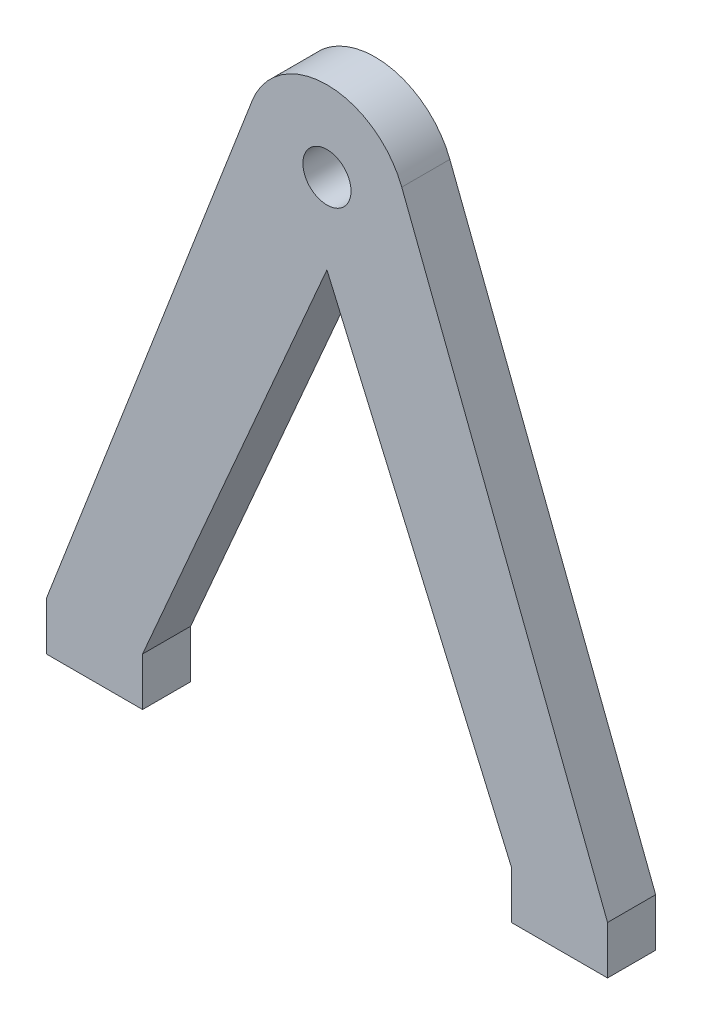
ISO-10303-21;
HEADER;
FILE_DESCRIPTION(('STEP AP214'),'2;1');
FILE_NAME('part.step','',(''),(''),'','','');
FILE_SCHEMA(('AUTOMOTIVE_DESIGN { 1 0 10303 214 1 1 1 1 }'));
ENDSEC;
DATA;
#1=APPLICATION_CONTEXT('core data for automotive mechanical design processes');
#2=APPLICATION_PROTOCOL_DEFINITION('international standard','automotive_design',2000,#1);
#3=PRODUCT_CONTEXT('',#1,'mechanical');
#4=PRODUCT('Part','Part','',(#3));
#5=PRODUCT_RELATED_PRODUCT_CATEGORY('part','',(#4));
#6=PRODUCT_DEFINITION_FORMATION('','',#4);
#7=PRODUCT_DEFINITION_CONTEXT('part definition',#1,'design');
#8=PRODUCT_DEFINITION('design','',#6,#7);
#9=PRODUCT_DEFINITION_SHAPE('','',#8);
#10=(LENGTH_UNIT() NAMED_UNIT(*) SI_UNIT(.MILLI.,.METRE.));
#11=(NAMED_UNIT(*) PLANE_ANGLE_UNIT() SI_UNIT($,.RADIAN.));
#12=(NAMED_UNIT(*) SI_UNIT($,.STERADIAN.) SOLID_ANGLE_UNIT());
#13=UNCERTAINTY_MEASURE_WITH_UNIT(LENGTH_MEASURE(1.E-05),#10,'distance_accuracy_value','');
#14=(GEOMETRIC_REPRESENTATION_CONTEXT(3) GLOBAL_UNCERTAINTY_ASSIGNED_CONTEXT((#13)) GLOBAL_UNIT_ASSIGNED_CONTEXT((#10,
#11,#12)) REPRESENTATION_CONTEXT('',''));
#15=CARTESIAN_POINT('',(0.,0.,0.));
#16=DIRECTION('',(0.,0.,1.));
#17=DIRECTION('',(1.,0.,0.));
#18=AXIS2_PLACEMENT_3D('',#15,#16,#17);
#19=CARTESIAN_POINT('',(35.,69.,6.));
#20=DIRECTION('',(0.,0.,-1.));
#21=DIRECTION('',(-1.,0.,0.));
#22=AXIS2_PLACEMENT_3D('',#19,#20,#21);
#23=CYLINDRICAL_SURFACE('',#22,10.);
#24=CARTESIAN_POINT('',(35.,69.,0.));
#25=DIRECTION('',(0.,0.,1.));
#26=DIRECTION('',(1.,0.,0.));
#27=AXIS2_PLACEMENT_3D('',#24,#25,#26);
#28=CIRCLE('',#27,10.);
#29=CARTESIAN_POINT('',(25.669132457116,72.5965137143007,0.));
#30=VERTEX_POINT('',#29);
#31=CARTESIAN_POINT('',(44.3308675428841,72.5965137143007,0.));
#32=VERTEX_POINT('',#31);
#33=EDGE_CURVE('E147',#30,#32,#28,.F.);
#34=ORIENTED_EDGE('',*,*,#33,.F.);
#35=DIRECTION('',(0.,0.,-1.));
#36=VECTOR('',#35,1.);
#37=CARTESIAN_POINT('',(25.669132457116,72.5965137143007,6.));
#38=LINE('',#37,#36);
#39=CARTESIAN_POINT('',(25.669132457116,72.5965137143007,6.));
#40=VERTEX_POINT('',#39);
#41=EDGE_CURVE('E11',#40,#30,#38,.T.);
#42=ORIENTED_EDGE('',*,*,#41,.F.);
#43=CARTESIAN_POINT('',(35.,69.,6.));
#44=DIRECTION('',(0.,0.,1.));
#45=DIRECTION('',(1.,0.,0.));
#46=AXIS2_PLACEMENT_3D('',#43,#44,#45);
#47=CIRCLE('',#46,10.);
#48=CARTESIAN_POINT('',(44.3308675428841,72.5965137143007,6.));
#49=VERTEX_POINT('',#48);
#50=EDGE_CURVE('E175',#40,#49,#47,.F.);
#51=ORIENTED_EDGE('',*,*,#50,.T.);
#52=DIRECTION('',(0.,0.,-1.));
#53=VECTOR('',#52,1.);
#54=CARTESIAN_POINT('',(44.3308675428841,72.5965137143007,6.));
#55=LINE('',#54,#53);
#56=EDGE_CURVE('E51',#49,#32,#55,.T.);
#57=ORIENTED_EDGE('',*,*,#56,.T.);
#58=EDGE_LOOP('',(#34,#42,#51,#57));
#59=FACE_BOUND('',#58,.T.);
#60=ADVANCED_FACE('F35',(#59),#23,.T.);
#61=CARTESIAN_POINT('',(-2.01351558505832,0.776094653829165,6.));
#62=DIRECTION('',(-0.933086754288406,0.359651371430067,0.));
#63=DIRECTION('',(-0.359651371430067,-0.933086754288406,0.));
#64=AXIS2_PLACEMENT_3D('',#61,#62,#63);
#65=PLANE('',#64);
#66=DIRECTION('',(0.359651371430067,0.933086754288406,0.));
#67=VECTOR('',#66,1.);
#68=CARTESIAN_POINT('',(-2.01351558505832,0.776094653829165,0.));
#69=LINE('',#68,#67);
#70=CARTESIAN_POINT('',(0.,6.,0.));
#71=VERTEX_POINT('',#70);
#72=EDGE_CURVE('E149',#71,#30,#69,.T.);
#73=ORIENTED_EDGE('',*,*,#72,.F.);
#74=DIRECTION('',(0.,0.,-1.));
#75=VECTOR('',#74,1.);
#76=CARTESIAN_POINT('',(0.,6.,6.));
#77=LINE('',#76,#75);
#78=CARTESIAN_POINT('',(0.,6.,6.));
#79=VERTEX_POINT('',#78);
#80=EDGE_CURVE('E43',#79,#71,#77,.T.);
#81=ORIENTED_EDGE('',*,*,#80,.F.);
#82=DIRECTION('',(0.359651371430067,0.933086754288406,0.));
#83=VECTOR('',#82,1.);
#84=CARTESIAN_POINT('',(-2.01351558505832,0.776094653829165,6.));
#85=LINE('',#84,#83);
#86=EDGE_CURVE('E316',#79,#40,#85,.T.);
#87=ORIENTED_EDGE('',*,*,#86,.T.);
#88=ORIENTED_EDGE('',*,*,#41,.T.);
#89=EDGE_LOOP('',(#73,#81,#87,#88));
#90=FACE_BOUND('',#89,.T.);
#91=ADVANCED_FACE('F200',(#90),#65,.T.);
#92=CARTESIAN_POINT('',(0.,0.,6.));
#93=DIRECTION('',(-1.,0.,0.));
#94=DIRECTION('',(0.,-1.,0.));
#95=AXIS2_PLACEMENT_3D('',#92,#93,#94);
#96=PLANE('',#95);
#97=DIRECTION('',(0.,1.,0.));
#98=VECTOR('',#97,1.);
#99=CARTESIAN_POINT('',(0.,0.,0.));
#100=LINE('',#99,#98);
#101=CARTESIAN_POINT('',(0.,0.,0.));
#102=VERTEX_POINT('',#101);
#103=EDGE_CURVE('E153',#102,#71,#100,.T.);
#104=ORIENTED_EDGE('',*,*,#103,.F.);
#105=DIRECTION('',(0.,0.,-1.));
#106=VECTOR('',#105,1.);
#107=CARTESIAN_POINT('',(0.,0.,6.));
#108=LINE('',#107,#106);
#109=CARTESIAN_POINT('',(0.,0.,6.));
#110=VERTEX_POINT('',#109);
#111=EDGE_CURVE('E189',#110,#102,#108,.T.);
#112=ORIENTED_EDGE('',*,*,#111,.F.);
#113=DIRECTION('',(0.,1.,0.));
#114=VECTOR('',#113,1.);
#115=CARTESIAN_POINT('',(0.,0.,6.));
#116=LINE('',#115,#114);
#117=EDGE_CURVE('E196',#110,#79,#116,.T.);
#118=ORIENTED_EDGE('',*,*,#117,.T.);
#119=ORIENTED_EDGE('',*,*,#80,.T.);
#120=EDGE_LOOP('',(#104,#112,#118,#119));
#121=FACE_BOUND('',#120,.T.);
#122=ADVANCED_FACE('F194',(#121),#96,.T.);
#123=CARTESIAN_POINT('',(0.,0.,6.));
#124=DIRECTION('',(0.,1.,0.));
#125=DIRECTION('',(0.,0.,1.));
#126=AXIS2_PLACEMENT_3D('',#123,#124,#125);
#127=PLANE('',#126);
#128=DIRECTION('',(1.,0.,0.));
#129=VECTOR('',#128,1.);
#130=CARTESIAN_POINT('',(0.,0.,0.));
#131=LINE('',#130,#129);
#132=CARTESIAN_POINT('',(12.,0.,0.));
#133=VERTEX_POINT('',#132);
#134=EDGE_CURVE('E156',#102,#133,#131,.T.);
#135=ORIENTED_EDGE('',*,*,#134,.T.);
#136=DIRECTION('',(0.,0.,-1.));
#137=VECTOR('',#136,1.);
#138=CARTESIAN_POINT('',(12.,0.,6.));
#139=LINE('',#138,#137);
#140=CARTESIAN_POINT('',(12.,0.,6.));
#141=VERTEX_POINT('',#140);
#142=EDGE_CURVE('E186',#141,#133,#139,.T.);
#143=ORIENTED_EDGE('',*,*,#142,.F.);
#144=DIRECTION('',(1.,0.,0.));
#145=VECTOR('',#144,1.);
#146=CARTESIAN_POINT('',(0.,0.,6.));
#147=LINE('',#146,#145);
#148=EDGE_CURVE('E218',#110,#141,#147,.T.);
#149=ORIENTED_EDGE('',*,*,#148,.F.);
#150=ORIENTED_EDGE('',*,*,#111,.T.);
#151=EDGE_LOOP('',(#135,#143,#149,#150));
#152=FACE_BOUND('',#151,.T.);
#153=ADVANCED_FACE('F209',(#152),#127,.F.);
#154=CARTESIAN_POINT('',(12.,0.,6.));
#155=DIRECTION('',(-1.,0.,0.));
#156=DIRECTION('',(0.,0.,1.));
#157=AXIS2_PLACEMENT_3D('',#154,#155,#156);
#158=PLANE('',#157);
#159=DIRECTION('',(0.,1.,0.));
#160=VECTOR('',#159,1.);
#161=CARTESIAN_POINT('',(12.,0.,0.));
#162=LINE('',#161,#160);
#163=CARTESIAN_POINT('',(12.,6.,0.));
#164=VERTEX_POINT('',#163);
#165=EDGE_CURVE('E158',#133,#164,#162,.T.);
#166=ORIENTED_EDGE('',*,*,#165,.T.);
#167=DIRECTION('',(0.,0.,-1.));
#168=VECTOR('',#167,1.);
#169=CARTESIAN_POINT('',(12.,6.,6.));
#170=LINE('',#169,#168);
#171=CARTESIAN_POINT('',(12.,6.,6.));
#172=VERTEX_POINT('',#171);
#173=EDGE_CURVE('E183',#172,#164,#170,.T.);
#174=ORIENTED_EDGE('',*,*,#173,.F.);
#175=DIRECTION('',(0.,1.,0.));
#176=VECTOR('',#175,1.);
#177=CARTESIAN_POINT('',(12.,0.,6.));
#178=LINE('',#177,#176);
#179=EDGE_CURVE('E215',#141,#172,#178,.T.);
#180=ORIENTED_EDGE('',*,*,#179,.F.);
#181=ORIENTED_EDGE('',*,*,#142,.T.);
#182=EDGE_LOOP('',(#166,#174,#180,#181));
#183=FACE_BOUND('',#182,.T.);
#184=ADVANCED_FACE('F213',(#183),#158,.F.);
#185=CARTESIAN_POINT('',(7.90713001797484,-3.43139604553625,6.));
#186=DIRECTION('',(-0.917345011096078,0.398093118022826,0.));
#187=DIRECTION('',(-0.398093118022826,-0.917345011096078,0.));
#188=AXIS2_PLACEMENT_3D('',#185,#186,#187);
#189=PLANE('',#188);
#190=DIRECTION('',(0.398093118022826,0.917345011096078,0.));
#191=VECTOR('',#190,1.);
#192=CARTESIAN_POINT('',(7.90713001797484,-3.43139604553625,0.));
#193=LINE('',#192,#191);
#194=CARTESIAN_POINT('',(35.,59.,0.));
#195=VERTEX_POINT('',#194);
#196=EDGE_CURVE('E160',#164,#195,#193,.T.);
#197=ORIENTED_EDGE('',*,*,#196,.T.);
#198=DIRECTION('',(0.,0.,-1.));
#199=VECTOR('',#198,1.);
#200=CARTESIAN_POINT('',(35.,59.,6.));
#201=LINE('',#200,#199);
#202=CARTESIAN_POINT('',(35.,59.,6.));
#203=VERTEX_POINT('',#202);
#204=EDGE_CURVE('E181',#203,#195,#201,.T.);
#205=ORIENTED_EDGE('',*,*,#204,.F.);
#206=DIRECTION('',(0.398093118022826,0.917345011096078,0.));
#207=VECTOR('',#206,1.);
#208=CARTESIAN_POINT('',(7.90713001797484,-3.43139604553625,6.));
#209=LINE('',#208,#207);
#210=EDGE_CURVE('E217',#172,#203,#209,.T.);
#211=ORIENTED_EDGE('',*,*,#210,.F.);
#212=ORIENTED_EDGE('',*,*,#173,.T.);
#213=EDGE_LOOP('',(#197,#205,#211,#212));
#214=FACE_BOUND('',#213,.T.);
#215=ADVANCED_FACE('F253',(#214),#189,.F.);
#216=CARTESIAN_POINT('',(50.9994008388257,22.1318154583583,6.));
#217=DIRECTION('',(-0.917345011096078,-0.398093118022826,0.));
#218=DIRECTION('',(0.398093118022827,-0.917345011096078,0.));
#219=AXIS2_PLACEMENT_3D('',#216,#217,#218);
#220=PLANE('',#219);
#221=DIRECTION('',(-0.398093118022827,0.917345011096078,0.));
#222=VECTOR('',#221,1.);
#223=CARTESIAN_POINT('',(50.9994008388257,22.1318154583583,0.));
#224=LINE('',#223,#222);
#225=CARTESIAN_POINT('',(58.,6.,0.));
#226=VERTEX_POINT('',#225);
#227=EDGE_CURVE('E163',#226,#195,#224,.T.);
#228=ORIENTED_EDGE('',*,*,#227,.F.);
#229=DIRECTION('',(0.,0.,-1.));
#230=VECTOR('',#229,1.);
#231=CARTESIAN_POINT('',(58.,6.,6.));
#232=LINE('',#231,#230);
#233=CARTESIAN_POINT('',(58.,6.,6.));
#234=VERTEX_POINT('',#233);
#235=EDGE_CURVE('E179',#234,#226,#232,.T.);
#236=ORIENTED_EDGE('',*,*,#235,.F.);
#237=DIRECTION('',(-0.398093118022827,0.917345011096078,0.));
#238=VECTOR('',#237,1.);
#239=CARTESIAN_POINT('',(50.9994008388257,22.1318154583583,6.));
#240=LINE('',#239,#238);
#241=EDGE_CURVE('E220',#234,#203,#240,.T.);
#242=ORIENTED_EDGE('',*,*,#241,.T.);
#243=ORIENTED_EDGE('',*,*,#204,.T.);
#244=EDGE_LOOP('',(#228,#236,#242,#243));
#245=FACE_BOUND('',#244,.T.);
#246=ADVANCED_FACE('F256',(#245),#220,.T.);
#247=CARTESIAN_POINT('',(58.,0.,6.));
#248=DIRECTION('',(-1.,0.,0.));
#249=DIRECTION('',(0.,0.,1.));
#250=AXIS2_PLACEMENT_3D('',#247,#248,#249);
#251=PLANE('',#250);
#252=DIRECTION('',(0.,1.,0.));
#253=VECTOR('',#252,1.);
#254=CARTESIAN_POINT('',(58.,0.,0.));
#255=LINE('',#254,#253);
#256=CARTESIAN_POINT('',(58.,0.,0.));
#257=VERTEX_POINT('',#256);
#258=EDGE_CURVE('E166',#257,#226,#255,.T.);
#259=ORIENTED_EDGE('',*,*,#258,.F.);
#260=DIRECTION('',(0.,0.,-1.));
#261=VECTOR('',#260,1.);
#262=CARTESIAN_POINT('',(58.,0.,6.));
#263=LINE('',#262,#261);
#264=CARTESIAN_POINT('',(58.,0.,6.));
#265=VERTEX_POINT('',#264);
#266=EDGE_CURVE('E139',#265,#257,#263,.T.);
#267=ORIENTED_EDGE('',*,*,#266,.F.);
#268=DIRECTION('',(0.,1.,0.));
#269=VECTOR('',#268,1.);
#270=CARTESIAN_POINT('',(58.,0.,6.));
#271=LINE('',#270,#269);
#272=EDGE_CURVE('E129',#265,#234,#271,.T.);
#273=ORIENTED_EDGE('',*,*,#272,.T.);
#274=ORIENTED_EDGE('',*,*,#235,.T.);
#275=EDGE_LOOP('',(#259,#267,#273,#274));
#276=FACE_BOUND('',#275,.T.);
#277=ADVANCED_FACE('F228',(#276),#251,.T.);
#278=CARTESIAN_POINT('',(0.,0.,6.));
#279=DIRECTION('',(0.,1.,0.));
#280=DIRECTION('',(0.,0.,1.));
#281=AXIS2_PLACEMENT_3D('',#278,#279,#280);
#282=PLANE('',#281);
#283=DIRECTION('',(1.,0.,0.));
#284=VECTOR('',#283,1.);
#285=CARTESIAN_POINT('',(0.,0.,0.));
#286=LINE('',#285,#284);
#287=CARTESIAN_POINT('',(70.,0.,0.));
#288=VERTEX_POINT('',#287);
#289=EDGE_CURVE('E136',#257,#288,#286,.T.);
#290=ORIENTED_EDGE('',*,*,#289,.T.);
#291=DIRECTION('',(0.,0.,-1.));
#292=VECTOR('',#291,1.);
#293=CARTESIAN_POINT('',(70.,0.,6.));
#294=LINE('',#293,#292);
#295=CARTESIAN_POINT('',(70.,0.,6.));
#296=VERTEX_POINT('',#295);
#297=EDGE_CURVE('E133',#296,#288,#294,.T.);
#298=ORIENTED_EDGE('',*,*,#297,.F.);
#299=DIRECTION('',(1.,0.,0.));
#300=VECTOR('',#299,1.);
#301=CARTESIAN_POINT('',(0.,0.,6.));
#302=LINE('',#301,#300);
#303=EDGE_CURVE('E120',#265,#296,#302,.T.);
#304=ORIENTED_EDGE('',*,*,#303,.F.);
#305=ORIENTED_EDGE('',*,*,#266,.T.);
#306=EDGE_LOOP('',(#290,#298,#304,#305));
#307=FACE_BOUND('',#306,.T.);
#308=ADVANCED_FACE('F134',(#307),#282,.F.);
#309=CARTESIAN_POINT('',(70.,0.,6.));
#310=DIRECTION('',(-1.,0.,0.));
#311=DIRECTION('',(0.,0.,1.));
#312=AXIS2_PLACEMENT_3D('',#309,#310,#311);
#313=PLANE('',#312);
#314=DIRECTION('',(0.,1.,0.));
#315=VECTOR('',#314,1.);
#316=CARTESIAN_POINT('',(70.,0.,0.));
#317=LINE('',#316,#315);
#318=CARTESIAN_POINT('',(70.,6.,0.));
#319=VERTEX_POINT('',#318);
#320=EDGE_CURVE('E170',#288,#319,#317,.T.);
#321=ORIENTED_EDGE('',*,*,#320,.T.);
#322=DIRECTION('',(0.,0.,-1.));
#323=VECTOR('',#322,1.);
#324=CARTESIAN_POINT('',(70.,6.,6.));
#325=LINE('',#324,#323);
#326=CARTESIAN_POINT('',(70.,6.,6.));
#327=VERTEX_POINT('',#326);
#328=EDGE_CURVE('E86',#327,#319,#325,.T.);
#329=ORIENTED_EDGE('',*,*,#328,.F.);
#330=DIRECTION('',(0.,1.,0.));
#331=VECTOR('',#330,1.);
#332=CARTESIAN_POINT('',(70.,0.,6.));
#333=LINE('',#332,#331);
#334=EDGE_CURVE('E126',#296,#327,#333,.T.);
#335=ORIENTED_EDGE('',*,*,#334,.F.);
#336=ORIENTED_EDGE('',*,*,#297,.T.);
#337=EDGE_LOOP('',(#321,#329,#335,#336));
#338=FACE_BOUND('',#337,.T.);
#339=ADVANCED_FACE('F141',(#338),#313,.F.);
#340=CARTESIAN_POINT('',(62.9590779570514,24.267109812843,6.));
#341=DIRECTION('',(0.933086754288406,0.359651371430067,0.));
#342=DIRECTION('',(-0.359651371430067,0.933086754288406,0.));
#343=AXIS2_PLACEMENT_3D('',#340,#341,#342);
#344=PLANE('',#343);
#345=DIRECTION('',(0.359651371430067,-0.933086754288406,0.));
#346=VECTOR('',#345,1.);
#347=CARTESIAN_POINT('',(62.9590779570514,24.267109812843,0.));
#348=LINE('',#347,#346);
#349=EDGE_CURVE('E172',#32,#319,#348,.T.);
#350=ORIENTED_EDGE('',*,*,#349,.F.);
#351=ORIENTED_EDGE('',*,*,#56,.F.);
#352=DIRECTION('',(0.359651371430067,-0.933086754288406,0.));
#353=VECTOR('',#352,1.);
#354=CARTESIAN_POINT('',(62.9590779570514,24.267109812843,6.));
#355=LINE('',#354,#353);
#356=EDGE_CURVE('E142',#49,#327,#355,.T.);
#357=ORIENTED_EDGE('',*,*,#356,.T.);
#358=ORIENTED_EDGE('',*,*,#328,.T.);
#359=EDGE_LOOP('',(#350,#351,#357,#358));
#360=FACE_BOUND('',#359,.T.);
#361=ADVANCED_FACE('F230',(#360),#344,.T.);
#362=CARTESIAN_POINT('',(0.,0.,6.));
#363=DIRECTION('',(0.,0.,1.));
#364=DIRECTION('',(1.,0.,0.));
#365=AXIS2_PLACEMENT_3D('',#362,#363,#364);
#366=PLANE('',#365);
#367=ORIENTED_EDGE('',*,*,#50,.F.);
#368=ORIENTED_EDGE('',*,*,#86,.F.);
#369=ORIENTED_EDGE('',*,*,#117,.F.);
#370=ORIENTED_EDGE('',*,*,#148,.T.);
#371=ORIENTED_EDGE('',*,*,#179,.T.);
#372=ORIENTED_EDGE('',*,*,#210,.T.);
#373=ORIENTED_EDGE('',*,*,#241,.F.);
#374=ORIENTED_EDGE('',*,*,#272,.F.);
#375=ORIENTED_EDGE('',*,*,#303,.T.);
#376=ORIENTED_EDGE('',*,*,#334,.T.);
#377=ORIENTED_EDGE('',*,*,#356,.F.);
#378=EDGE_LOOP('',(#367,#368,#369,#370,#371,#372,#373,#374,#375,#376,#377));
#379=FACE_BOUND('',#378,.T.);
#380=CARTESIAN_POINT('',(35.,69.,6.));
#381=DIRECTION('',(0.,0.,1.));
#382=DIRECTION('',(1.,0.,0.));
#383=AXIS2_PLACEMENT_3D('',#380,#381,#382);
#384=CIRCLE('',#383,3.);
#385=CARTESIAN_POINT('',(38.,69.,6.));
#386=VERTEX_POINT('',#385);
#387=EDGE_CURVE('E311',#386,#386,#384,.T.);
#388=ORIENTED_EDGE('',*,*,#387,.F.);
#389=EDGE_LOOP('',(#388));
#390=FACE_BOUND('',#389,.T.);
#391=ADVANCED_FACE('F122',(#379,#390),#366,.T.);
#392=CARTESIAN_POINT('',(0.,0.,0.));
#393=DIRECTION('',(0.,0.,1.));
#394=DIRECTION('',(1.,0.,0.));
#395=AXIS2_PLACEMENT_3D('',#392,#393,#394);
#396=PLANE('',#395);
#397=ORIENTED_EDGE('',*,*,#33,.T.);
#398=ORIENTED_EDGE('',*,*,#349,.T.);
#399=ORIENTED_EDGE('',*,*,#320,.F.);
#400=ORIENTED_EDGE('',*,*,#289,.F.);
#401=ORIENTED_EDGE('',*,*,#258,.T.);
#402=ORIENTED_EDGE('',*,*,#227,.T.);
#403=ORIENTED_EDGE('',*,*,#196,.F.);
#404=ORIENTED_EDGE('',*,*,#165,.F.);
#405=ORIENTED_EDGE('',*,*,#134,.F.);
#406=ORIENTED_EDGE('',*,*,#103,.T.);
#407=ORIENTED_EDGE('',*,*,#72,.T.);
#408=EDGE_LOOP('',(#397,#398,#399,#400,#401,#402,#403,#404,#405,#406,#407));
#409=FACE_BOUND('',#408,.T.);
#410=CARTESIAN_POINT('',(35.,69.,0.));
#411=DIRECTION('',(0.,0.,1.));
#412=DIRECTION('',(1.,0.,0.));
#413=AXIS2_PLACEMENT_3D('',#410,#411,#412);
#414=CIRCLE('',#413,3.);
#415=CARTESIAN_POINT('',(38.,69.,0.));
#416=VERTEX_POINT('',#415);
#417=EDGE_CURVE('E150',#416,#416,#414,.T.);
#418=ORIENTED_EDGE('',*,*,#417,.T.);
#419=EDGE_LOOP('',(#418));
#420=FACE_BOUND('',#419,.T.);
#421=ADVANCED_FACE('F203',(#409,#420),#396,.F.);
#422=CARTESIAN_POINT('',(35.,69.,0.));
#423=DIRECTION('',(0.,0.,1.));
#424=DIRECTION('',(1.,0.,0.));
#425=AXIS2_PLACEMENT_3D('',#422,#423,#424);
#426=CYLINDRICAL_SURFACE('',#425,3.);
#427=ORIENTED_EDGE('',*,*,#417,.F.);
#428=EDGE_LOOP('',(#427));
#429=FACE_BOUND('',#428,.T.);
#430=ORIENTED_EDGE('',*,*,#387,.T.);
#431=EDGE_LOOP('',(#430));
#432=FACE_BOUND('',#431,.T.);
#433=ADVANCED_FACE('F294',(#429,#432),#426,.F.);
#434=CLOSED_SHELL('',(#60,#91,#122,#153,#184,#215,#246,#277,#308,#339,#361,#391,#421,#433));
#435=MANIFOLD_SOLID_BREP('B2',#434);
#436=ADVANCED_BREP_SHAPE_REPRESENTATION('',(#18,#435),#14);
#437=SHAPE_DEFINITION_REPRESENTATION(#9,#436);
ENDSEC;
END-ISO-10303-21;
